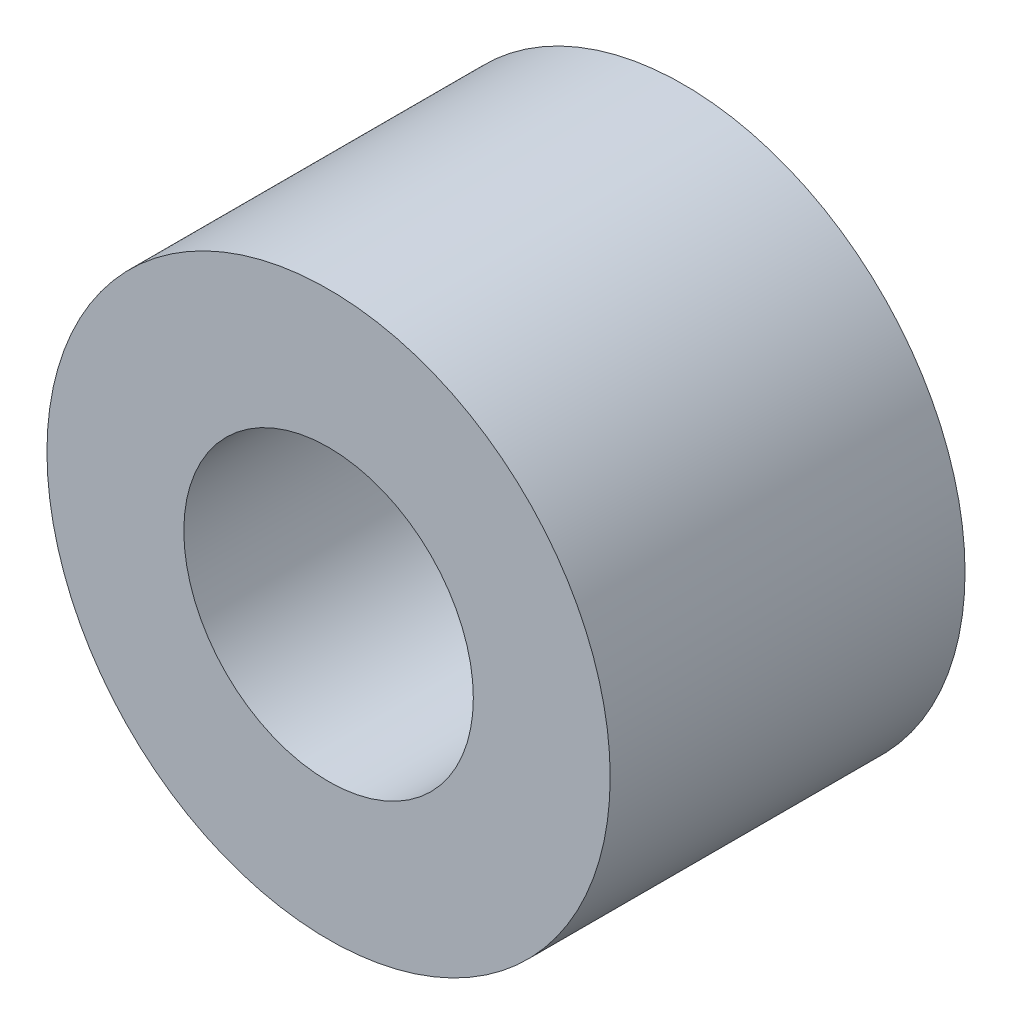
ISO-10303-21;
HEADER;
FILE_DESCRIPTION(('STEP AP214'),'2;1');
FILE_NAME('part.step','',(''),(''),'','','');
FILE_SCHEMA(('AUTOMOTIVE_DESIGN { 1 0 10303 214 1 1 1 1 }'));
ENDSEC;
DATA;
#1=APPLICATION_CONTEXT('core data for automotive mechanical design processes');
#2=APPLICATION_PROTOCOL_DEFINITION('international standard','automotive_design',2000,#1);
#3=PRODUCT_CONTEXT('',#1,'mechanical');
#4=PRODUCT('Part','Part','',(#3));
#5=PRODUCT_RELATED_PRODUCT_CATEGORY('part','',(#4));
#6=PRODUCT_DEFINITION_FORMATION('','',#4);
#7=PRODUCT_DEFINITION_CONTEXT('part definition',#1,'design');
#8=PRODUCT_DEFINITION('design','',#6,#7);
#9=PRODUCT_DEFINITION_SHAPE('','',#8);
#10=(LENGTH_UNIT() NAMED_UNIT(*) SI_UNIT(.MILLI.,.METRE.));
#11=(NAMED_UNIT(*) PLANE_ANGLE_UNIT() SI_UNIT($,.RADIAN.));
#12=(NAMED_UNIT(*) SI_UNIT($,.STERADIAN.) SOLID_ANGLE_UNIT());
#13=UNCERTAINTY_MEASURE_WITH_UNIT(LENGTH_MEASURE(1.E-05),#10,'distance_accuracy_value','');
#14=(GEOMETRIC_REPRESENTATION_CONTEXT(3) GLOBAL_UNCERTAINTY_ASSIGNED_CONTEXT((#13)) GLOBAL_UNIT_ASSIGNED_CONTEXT((#10,
#11,#12)) REPRESENTATION_CONTEXT('',''));
#15=CARTESIAN_POINT('',(0.,0.,0.));
#16=DIRECTION('',(0.,0.,1.));
#17=DIRECTION('',(1.,0.,0.));
#18=AXIS2_PLACEMENT_3D('',#15,#16,#17);
#19=CARTESIAN_POINT('',(0.,0.,8.001));
#20=DIRECTION('',(0.,0.,1.));
#21=DIRECTION('',(1.,0.,0.));
#22=AXIS2_PLACEMENT_3D('',#19,#20,#21);
#23=PLANE('',#22);
#24=CARTESIAN_POINT('',(0.,0.,8.001));
#25=DIRECTION('',(0.,0.,1.));
#26=DIRECTION('',(1.,0.,0.));
#27=AXIS2_PLACEMENT_3D('',#24,#25,#26);
#28=CIRCLE('',#27,6.35);
#29=CARTESIAN_POINT('',(6.35,0.,8.001));
#30=VERTEX_POINT('',#29);
#31=EDGE_CURVE('E10',#30,#30,#28,.T.);
#32=ORIENTED_EDGE('',*,*,#31,.T.);
#33=EDGE_LOOP('',(#32));
#34=FACE_BOUND('',#33,.T.);
#35=CARTESIAN_POINT('',(0.,0.,8.001));
#36=DIRECTION('',(0.,0.,1.));
#37=DIRECTION('',(1.,0.,0.));
#38=AXIS2_PLACEMENT_3D('',#35,#36,#37);
#39=CIRCLE('',#38,3.2639);
#40=CARTESIAN_POINT('',(3.2639,0.,8.001));
#41=VERTEX_POINT('',#40);
#42=EDGE_CURVE('E58',#41,#41,#39,.T.);
#43=ORIENTED_EDGE('',*,*,#42,.F.);
#44=EDGE_LOOP('',(#43));
#45=FACE_BOUND('',#44,.T.);
#46=ADVANCED_FACE('F43',(#34,#45),#23,.T.);
#47=CARTESIAN_POINT('',(0.,0.,0.));
#48=DIRECTION('',(0.,0.,1.));
#49=DIRECTION('',(1.,0.,0.));
#50=AXIS2_PLACEMENT_3D('',#47,#48,#49);
#51=PLANE('',#50);
#52=CARTESIAN_POINT('',(0.,0.,0.));
#53=DIRECTION('',(0.,0.,1.));
#54=DIRECTION('',(1.,0.,0.));
#55=AXIS2_PLACEMENT_3D('',#52,#53,#54);
#56=CIRCLE('',#55,6.35);
#57=CARTESIAN_POINT('',(6.35,0.,0.));
#58=VERTEX_POINT('',#57);
#59=EDGE_CURVE('E47',#58,#58,#56,.T.);
#60=ORIENTED_EDGE('',*,*,#59,.F.);
#61=EDGE_LOOP('',(#60));
#62=FACE_BOUND('',#61,.T.);
#63=CARTESIAN_POINT('',(0.,0.,0.));
#64=DIRECTION('',(0.,0.,1.));
#65=DIRECTION('',(1.,0.,0.));
#66=AXIS2_PLACEMENT_3D('',#63,#64,#65);
#67=CIRCLE('',#66,3.2639);
#68=CARTESIAN_POINT('',(3.2639,0.,0.));
#69=VERTEX_POINT('',#68);
#70=EDGE_CURVE('E60',#69,#69,#67,.T.);
#71=ORIENTED_EDGE('',*,*,#70,.T.);
#72=EDGE_LOOP('',(#71));
#73=FACE_BOUND('',#72,.T.);
#74=ADVANCED_FACE('F74',(#62,#73),#51,.F.);
#75=CARTESIAN_POINT('',(0.,0.,8.001));
#76=DIRECTION('',(0.,0.,-1.));
#77=DIRECTION('',(-1.,0.,0.));
#78=AXIS2_PLACEMENT_3D('',#75,#76,#77);
#79=CYLINDRICAL_SURFACE('',#78,6.35);
#80=ORIENTED_EDGE('',*,*,#31,.F.);
#81=EDGE_LOOP('',(#80));
#82=FACE_BOUND('',#81,.T.);
#83=ORIENTED_EDGE('',*,*,#59,.T.);
#84=EDGE_LOOP('',(#83));
#85=FACE_BOUND('',#84,.T.);
#86=ADVANCED_FACE('F45',(#82,#85),#79,.T.);
#87=CARTESIAN_POINT('',(0.,0.,8.001));
#88=DIRECTION('',(0.,0.,-1.));
#89=DIRECTION('',(-1.,0.,0.));
#90=AXIS2_PLACEMENT_3D('',#87,#88,#89);
#91=CYLINDRICAL_SURFACE('',#90,3.2639);
#92=ORIENTED_EDGE('',*,*,#42,.T.);
#93=EDGE_LOOP('',(#92));
#94=FACE_BOUND('',#93,.T.);
#95=ORIENTED_EDGE('',*,*,#70,.F.);
#96=EDGE_LOOP('',(#95));
#97=FACE_BOUND('',#96,.T.);
#98=ADVANCED_FACE('F70',(#94,#97),#91,.F.);
#99=CLOSED_SHELL('',(#46,#74,#86,#98));
#100=MANIFOLD_SOLID_BREP('B2',#99);
#101=ADVANCED_BREP_SHAPE_REPRESENTATION('',(#18,#100),#14);
#102=SHAPE_DEFINITION_REPRESENTATION(#9,#101);
ENDSEC;
END-ISO-10303-21;
